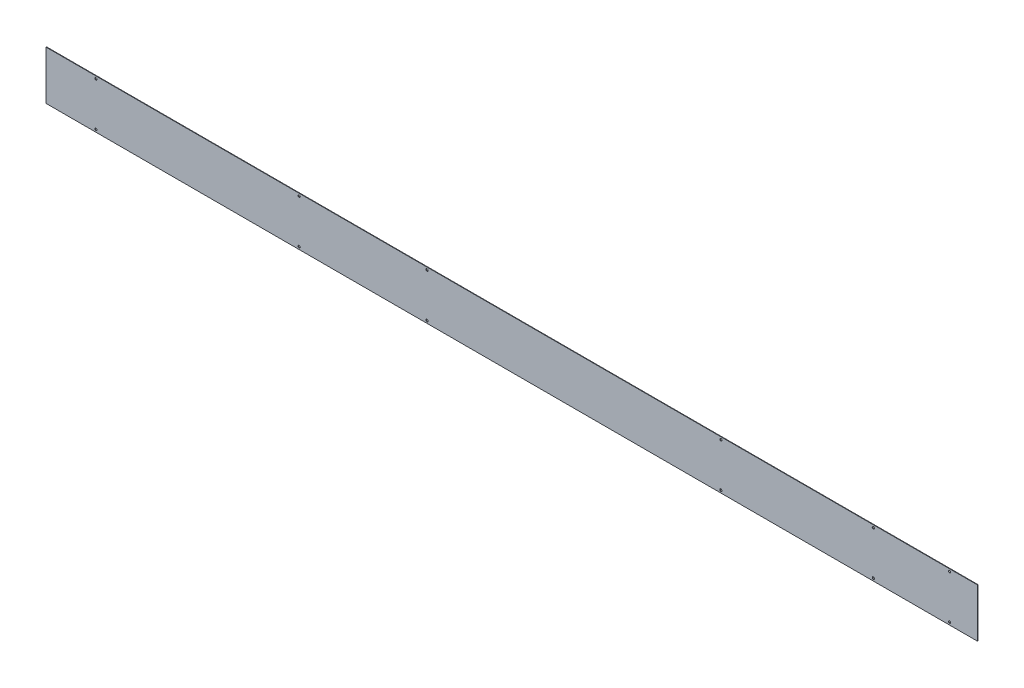
ISO-10303-21;
HEADER;
FILE_DESCRIPTION(('STEP AP214'),'2;1');
FILE_NAME('part.step','',(''),(''),'','','');
FILE_SCHEMA(('AUTOMOTIVE_DESIGN { 1 0 10303 214 1 1 1 1 }'));
ENDSEC;
DATA;
#1=APPLICATION_CONTEXT('core data for automotive mechanical design processes');
#2=APPLICATION_PROTOCOL_DEFINITION('international standard','automotive_design',2000,#1);
#3=PRODUCT_CONTEXT('',#1,'mechanical');
#4=PRODUCT('Part','Part','',(#3));
#5=PRODUCT_RELATED_PRODUCT_CATEGORY('part','',(#4));
#6=PRODUCT_DEFINITION_FORMATION('','',#4);
#7=PRODUCT_DEFINITION_CONTEXT('part definition',#1,'design');
#8=PRODUCT_DEFINITION('design','',#6,#7);
#9=PRODUCT_DEFINITION_SHAPE('','',#8);
#10=(LENGTH_UNIT() NAMED_UNIT(*) SI_UNIT(.MILLI.,.METRE.));
#11=(NAMED_UNIT(*) PLANE_ANGLE_UNIT() SI_UNIT($,.RADIAN.));
#12=(NAMED_UNIT(*) SI_UNIT($,.STERADIAN.) SOLID_ANGLE_UNIT());
#13=UNCERTAINTY_MEASURE_WITH_UNIT(LENGTH_MEASURE(1.E-05),#10,'distance_accuracy_value','');
#14=(GEOMETRIC_REPRESENTATION_CONTEXT(3) GLOBAL_UNCERTAINTY_ASSIGNED_CONTEXT((#13)) GLOBAL_UNIT_ASSIGNED_CONTEXT((#10,
#11,#12)) REPRESENTATION_CONTEXT('',''));
#15=CARTESIAN_POINT('',(0.,0.,0.));
#16=DIRECTION('',(0.,0.,1.));
#17=DIRECTION('',(1.,0.,0.));
#18=AXIS2_PLACEMENT_3D('',#15,#16,#17);
#19=CARTESIAN_POINT('',(698.5,-36.576,-0.75946));
#20=DIRECTION('',(1.,0.,0.));
#21=DIRECTION('',(0.,0.,-1.));
#22=AXIS2_PLACEMENT_3D('',#19,#20,#21);
#23=PLANE('',#22);
#24=DIRECTION('',(0.,1.,0.));
#25=VECTOR('',#24,1.);
#26=CARTESIAN_POINT('',(698.5,-36.576,0.));
#27=LINE('',#26,#25);
#28=CARTESIAN_POINT('',(698.5,-36.576,0.));
#29=VERTEX_POINT('',#28);
#30=CARTESIAN_POINT('',(698.5,36.576,0.));
#31=VERTEX_POINT('',#30);
#32=EDGE_CURVE('E107',#29,#31,#27,.T.);
#33=ORIENTED_EDGE('',*,*,#32,.F.);
#34=DIRECTION('',(0.,0.,1.));
#35=VECTOR('',#34,1.);
#36=CARTESIAN_POINT('',(698.5,-36.576,-0.75946));
#37=LINE('',#36,#35);
#38=CARTESIAN_POINT('',(698.5,-36.576,-0.75946));
#39=VERTEX_POINT('',#38);
#40=EDGE_CURVE('E11',#39,#29,#37,.T.);
#41=ORIENTED_EDGE('',*,*,#40,.F.);
#42=DIRECTION('',(0.,1.,0.));
#43=VECTOR('',#42,1.);
#44=CARTESIAN_POINT('',(698.5,-36.576,-0.75946));
#45=LINE('',#44,#43);
#46=CARTESIAN_POINT('',(698.5,36.576,-0.75946));
#47=VERTEX_POINT('',#46);
#48=EDGE_CURVE('E100',#39,#47,#45,.T.);
#49=ORIENTED_EDGE('',*,*,#48,.T.);
#50=DIRECTION('',(0.,0.,1.));
#51=VECTOR('',#50,1.);
#52=CARTESIAN_POINT('',(698.5,36.576,-0.75946));
#53=LINE('',#52,#51);
#54=EDGE_CURVE('E83',#47,#31,#53,.T.);
#55=ORIENTED_EDGE('',*,*,#54,.T.);
#56=EDGE_LOOP('',(#33,#41,#49,#55));
#57=FACE_BOUND('',#56,.T.);
#58=ADVANCED_FACE('F40',(#57),#23,.T.);
#59=CARTESIAN_POINT('',(-698.5,-36.576,-0.75946));
#60=DIRECTION('',(0.,-1.,0.));
#61=DIRECTION('',(0.,0.,-1.));
#62=AXIS2_PLACEMENT_3D('',#59,#60,#61);
#63=PLANE('',#62);
#64=DIRECTION('',(1.,0.,0.));
#65=VECTOR('',#64,1.);
#66=CARTESIAN_POINT('',(-698.5,-36.576,0.));
#67=LINE('',#66,#65);
#68=CARTESIAN_POINT('',(-698.5,-36.576,0.));
#69=VERTEX_POINT('',#68);
#70=EDGE_CURVE('E102',#69,#29,#67,.T.);
#71=ORIENTED_EDGE('',*,*,#70,.F.);
#72=DIRECTION('',(0.,0.,1.));
#73=VECTOR('',#72,1.);
#74=CARTESIAN_POINT('',(-698.5,-36.576,-0.75946));
#75=LINE('',#74,#73);
#76=CARTESIAN_POINT('',(-698.5,-36.576,-0.75946));
#77=VERTEX_POINT('',#76);
#78=EDGE_CURVE('E49',#77,#69,#75,.T.);
#79=ORIENTED_EDGE('',*,*,#78,.F.);
#80=DIRECTION('',(1.,0.,0.));
#81=VECTOR('',#80,1.);
#82=CARTESIAN_POINT('',(-698.5,-36.576,-0.75946));
#83=LINE('',#82,#81);
#84=EDGE_CURVE('E97',#77,#39,#83,.T.);
#85=ORIENTED_EDGE('',*,*,#84,.T.);
#86=ORIENTED_EDGE('',*,*,#40,.T.);
#87=EDGE_LOOP('',(#71,#79,#85,#86));
#88=FACE_BOUND('',#87,.T.);
#89=ADVANCED_FACE('F170',(#88),#63,.T.);
#90=CARTESIAN_POINT('',(-698.5,-36.576,-0.75946));
#91=DIRECTION('',(-1.,0.,0.));
#92=DIRECTION('',(0.,0.,1.));
#93=AXIS2_PLACEMENT_3D('',#90,#91,#92);
#94=PLANE('',#93);
#95=DIRECTION('',(0.,-1.,0.));
#96=VECTOR('',#95,1.);
#97=CARTESIAN_POINT('',(-698.5,-36.576,0.));
#98=LINE('',#97,#96);
#99=CARTESIAN_POINT('',(-698.5,36.576,0.));
#100=VERTEX_POINT('',#99);
#101=EDGE_CURVE('E91',#100,#69,#98,.T.);
#102=ORIENTED_EDGE('',*,*,#101,.F.);
#103=DIRECTION('',(0.,0.,1.));
#104=VECTOR('',#103,1.);
#105=CARTESIAN_POINT('',(-698.5,36.576,-0.75946));
#106=LINE('',#105,#104);
#107=CARTESIAN_POINT('',(-698.5,36.576,-0.75946));
#108=VERTEX_POINT('',#107);
#109=EDGE_CURVE('E86',#108,#100,#106,.T.);
#110=ORIENTED_EDGE('',*,*,#109,.F.);
#111=DIRECTION('',(0.,-1.,0.));
#112=VECTOR('',#111,1.);
#113=CARTESIAN_POINT('',(-698.5,-36.576,-0.75946));
#114=LINE('',#113,#112);
#115=EDGE_CURVE('E89',#108,#77,#114,.T.);
#116=ORIENTED_EDGE('',*,*,#115,.T.);
#117=ORIENTED_EDGE('',*,*,#78,.T.);
#118=EDGE_LOOP('',(#102,#110,#116,#117));
#119=FACE_BOUND('',#118,.T.);
#120=ADVANCED_FACE('F88',(#119),#94,.T.);
#121=CARTESIAN_POINT('',(-698.5,36.576,-0.75946));
#122=DIRECTION('',(0.,1.,0.));
#123=DIRECTION('',(0.,0.,1.));
#124=AXIS2_PLACEMENT_3D('',#121,#122,#123);
#125=PLANE('',#124);
#126=DIRECTION('',(-1.,0.,0.));
#127=VECTOR('',#126,1.);
#128=CARTESIAN_POINT('',(-698.5,36.576,0.));
#129=LINE('',#128,#127);
#130=EDGE_CURVE('E110',#31,#100,#129,.T.);
#131=ORIENTED_EDGE('',*,*,#130,.F.);
#132=ORIENTED_EDGE('',*,*,#54,.F.);
#133=DIRECTION('',(-1.,0.,0.));
#134=VECTOR('',#133,1.);
#135=CARTESIAN_POINT('',(-698.5,36.576,-0.75946));
#136=LINE('',#135,#134);
#137=EDGE_CURVE('E96',#47,#108,#136,.T.);
#138=ORIENTED_EDGE('',*,*,#137,.T.);
#139=ORIENTED_EDGE('',*,*,#109,.T.);
#140=EDGE_LOOP('',(#131,#132,#138,#139));
#141=FACE_BOUND('',#140,.T.);
#142=ADVANCED_FACE('F99',(#141),#125,.T.);
#143=CARTESIAN_POINT('',(0.,0.,-0.75946));
#144=DIRECTION('',(0.,0.,-1.));
#145=DIRECTION('',(-1.,0.,0.));
#146=AXIS2_PLACEMENT_3D('',#143,#144,#145);
#147=PLANE('',#146);
#148=CARTESIAN_POINT('',(313.69,-32.766,-0.75946));
#149=DIRECTION('',(0.,0.,1.));
#150=DIRECTION('',(1.,0.,0.));
#151=AXIS2_PLACEMENT_3D('',#148,#149,#150);
#152=CIRCLE('',#151,1.6509999999999);
#153=CARTESIAN_POINT('',(315.341,-32.766,-0.75946));
#154=VERTEX_POINT('',#153);
#155=EDGE_CURVE('E400',#154,#154,#152,.T.);
#156=ORIENTED_EDGE('',*,*,#155,.T.);
#157=EDGE_LOOP('',(#156));
#158=FACE_BOUND('',#157,.T.);
#159=CARTESIAN_POINT('',(542.29,32.766,-0.75946));
#160=DIRECTION('',(0.,0.,1.));
#161=DIRECTION('',(1.,0.,0.));
#162=AXIS2_PLACEMENT_3D('',#159,#160,#161);
#163=CIRCLE('',#162,1.65099999999991);
#164=CARTESIAN_POINT('',(543.941,32.766,-0.75946));
#165=VERTEX_POINT('',#164);
#166=EDGE_CURVE('E396',#165,#165,#163,.T.);
#167=ORIENTED_EDGE('',*,*,#166,.T.);
#168=EDGE_LOOP('',(#167));
#169=FACE_BOUND('',#168,.T.);
#170=CARTESIAN_POINT('',(542.29,-32.766,-0.75946));
#171=DIRECTION('',(0.,0.,1.));
#172=DIRECTION('',(1.,0.,0.));
#173=AXIS2_PLACEMENT_3D('',#170,#171,#172);
#174=CIRCLE('',#173,1.65099999999991);
#175=CARTESIAN_POINT('',(543.941,-32.766,-0.75946));
#176=VERTEX_POINT('',#175);
#177=EDGE_CURVE('E365',#176,#176,#174,.T.);
#178=ORIENTED_EDGE('',*,*,#177,.T.);
#179=EDGE_LOOP('',(#178));
#180=FACE_BOUND('',#179,.T.);
#181=CARTESIAN_POINT('',(656.59,32.766,-0.75946));
#182=DIRECTION('',(0.,0.,1.));
#183=DIRECTION('',(1.,0.,0.));
#184=AXIS2_PLACEMENT_3D('',#181,#182,#183);
#185=CIRCLE('',#184,1.65099999999991);
#186=CARTESIAN_POINT('',(658.241,32.766,-0.75946));
#187=VERTEX_POINT('',#186);
#188=EDGE_CURVE('E397',#187,#187,#185,.T.);
#189=ORIENTED_EDGE('',*,*,#188,.T.);
#190=EDGE_LOOP('',(#189));
#191=FACE_BOUND('',#190,.T.);
#192=CARTESIAN_POINT('',(-623.57,-32.766,-0.75946));
#193=DIRECTION('',(0.,0.,1.));
#194=DIRECTION('',(1.,0.,0.));
#195=AXIS2_PLACEMENT_3D('',#192,#193,#194);
#196=CIRCLE('',#195,1.65099999999991);
#197=CARTESIAN_POINT('',(-621.919,-32.766,-0.75946));
#198=VERTEX_POINT('',#197);
#199=EDGE_CURVE('E418',#198,#198,#196,.T.);
#200=ORIENTED_EDGE('',*,*,#199,.T.);
#201=EDGE_LOOP('',(#200));
#202=FACE_BOUND('',#201,.T.);
#203=CARTESIAN_POINT('',(-127.,32.766,-0.75946));
#204=DIRECTION('',(0.,0.,1.));
#205=DIRECTION('',(1.,0.,0.));
#206=AXIS2_PLACEMENT_3D('',#203,#204,#205);
#207=CIRCLE('',#206,1.65099999999999);
#208=CARTESIAN_POINT('',(-125.349,32.766,-0.75946));
#209=VERTEX_POINT('',#208);
#210=EDGE_CURVE('E415',#209,#209,#207,.T.);
#211=ORIENTED_EDGE('',*,*,#210,.T.);
#212=EDGE_LOOP('',(#211));
#213=FACE_BOUND('',#212,.T.);
#214=CARTESIAN_POINT('',(-127.,-32.766,-0.75946));
#215=DIRECTION('',(0.,0.,1.));
#216=DIRECTION('',(1.,0.,0.));
#217=AXIS2_PLACEMENT_3D('',#214,#215,#216);
#218=CIRCLE('',#217,1.65099999999999);
#219=CARTESIAN_POINT('',(-125.349,-32.766,-0.75946));
#220=VERTEX_POINT('',#219);
#221=EDGE_CURVE('E412',#220,#220,#218,.T.);
#222=ORIENTED_EDGE('',*,*,#221,.T.);
#223=EDGE_LOOP('',(#222));
#224=FACE_BOUND('',#223,.T.);
#225=CARTESIAN_POINT('',(313.69,32.766,-0.75946));
#226=DIRECTION('',(0.,0.,1.));
#227=DIRECTION('',(1.,0.,0.));
#228=AXIS2_PLACEMENT_3D('',#225,#226,#227);
#229=CIRCLE('',#228,1.6509999999999);
#230=CARTESIAN_POINT('',(315.341,32.766,-0.75946));
#231=VERTEX_POINT('',#230);
#232=EDGE_CURVE('E410',#231,#231,#229,.T.);
#233=ORIENTED_EDGE('',*,*,#232,.T.);
#234=EDGE_LOOP('',(#233));
#235=FACE_BOUND('',#234,.T.);
#236=CARTESIAN_POINT('',(-318.77,-32.766,-0.75946));
#237=DIRECTION('',(0.,0.,1.));
#238=DIRECTION('',(1.,0.,0.));
#239=AXIS2_PLACEMENT_3D('',#236,#237,#238);
#240=CIRCLE('',#239,1.6509999999999);
#241=CARTESIAN_POINT('',(-317.119,-32.766,-0.75946));
#242=VERTEX_POINT('',#241);
#243=EDGE_CURVE('E435',#242,#242,#240,.T.);
#244=ORIENTED_EDGE('',*,*,#243,.T.);
#245=EDGE_LOOP('',(#244));
#246=FACE_BOUND('',#245,.T.);
#247=CARTESIAN_POINT('',(-318.77,32.766,-0.75946));
#248=DIRECTION('',(0.,0.,1.));
#249=DIRECTION('',(1.,0.,0.));
#250=AXIS2_PLACEMENT_3D('',#247,#248,#249);
#251=CIRCLE('',#250,1.6509999999999);
#252=CARTESIAN_POINT('',(-317.119,32.766,-0.75946));
#253=VERTEX_POINT('',#252);
#254=EDGE_CURVE('E406',#253,#253,#251,.T.);
#255=ORIENTED_EDGE('',*,*,#254,.T.);
#256=EDGE_LOOP('',(#255));
#257=FACE_BOUND('',#256,.T.);
#258=CARTESIAN_POINT('',(656.59,-32.766,-0.75946));
#259=DIRECTION('',(0.,0.,1.));
#260=DIRECTION('',(1.,0.,0.));
#261=AXIS2_PLACEMENT_3D('',#258,#259,#260);
#262=CIRCLE('',#261,1.65099999999991);
#263=CARTESIAN_POINT('',(658.241,-32.766,-0.75946));
#264=VERTEX_POINT('',#263);
#265=EDGE_CURVE('E403',#264,#264,#262,.T.);
#266=ORIENTED_EDGE('',*,*,#265,.T.);
#267=EDGE_LOOP('',(#266));
#268=FACE_BOUND('',#267,.T.);
#269=CARTESIAN_POINT('',(-623.57,32.766,-0.75946));
#270=DIRECTION('',(0.,0.,1.));
#271=DIRECTION('',(1.,0.,0.));
#272=AXIS2_PLACEMENT_3D('',#269,#270,#271);
#273=CIRCLE('',#272,1.65099999999991);
#274=CARTESIAN_POINT('',(-621.919,32.766,-0.75946));
#275=VERTEX_POINT('',#274);
#276=EDGE_CURVE('E121',#275,#275,#273,.T.);
#277=ORIENTED_EDGE('',*,*,#276,.T.);
#278=EDGE_LOOP('',(#277));
#279=FACE_BOUND('',#278,.T.);
#280=ORIENTED_EDGE('',*,*,#48,.F.);
#281=ORIENTED_EDGE('',*,*,#84,.F.);
#282=ORIENTED_EDGE('',*,*,#115,.F.);
#283=ORIENTED_EDGE('',*,*,#137,.F.);
#284=EDGE_LOOP('',(#280,#281,#282,#283));
#285=FACE_BOUND('',#284,.T.);
#286=ADVANCED_FACE('F95',(#158,#169,#180,#191,#202,#213,#224,#235,#246,#257,#268,#279,#285),
#147,.T.);
#287=CARTESIAN_POINT('',(0.,0.,0.));
#288=DIRECTION('',(0.,0.,-1.));
#289=DIRECTION('',(-1.,0.,0.));
#290=AXIS2_PLACEMENT_3D('',#287,#288,#289);
#291=PLANE('',#290);
#292=CARTESIAN_POINT('',(313.69,-32.766,0.));
#293=DIRECTION('',(0.,0.,-1.));
#294=DIRECTION('',(-1.,0.,0.));
#295=AXIS2_PLACEMENT_3D('',#292,#293,#294);
#296=CIRCLE('',#295,1.6509999999999);
#297=CARTESIAN_POINT('',(312.039,-32.766,0.));
#298=VERTEX_POINT('',#297);
#299=EDGE_CURVE('E43',#298,#298,#296,.T.);
#300=ORIENTED_EDGE('',*,*,#299,.T.);
#301=EDGE_LOOP('',(#300));
#302=FACE_BOUND('',#301,.T.);
#303=CARTESIAN_POINT('',(542.29,32.766,0.));
#304=DIRECTION('',(0.,0.,-1.));
#305=DIRECTION('',(-1.,0.,0.));
#306=AXIS2_PLACEMENT_3D('',#303,#304,#305);
#307=CIRCLE('',#306,1.65099999999991);
#308=CARTESIAN_POINT('',(540.639,32.766,0.));
#309=VERTEX_POINT('',#308);
#310=EDGE_CURVE('E147',#309,#309,#307,.T.);
#311=ORIENTED_EDGE('',*,*,#310,.T.);
#312=EDGE_LOOP('',(#311));
#313=FACE_BOUND('',#312,.T.);
#314=CARTESIAN_POINT('',(542.29,-32.766,0.));
#315=DIRECTION('',(0.,0.,-1.));
#316=DIRECTION('',(-1.,0.,0.));
#317=AXIS2_PLACEMENT_3D('',#314,#315,#316);
#318=CIRCLE('',#317,1.65099999999991);
#319=CARTESIAN_POINT('',(540.639,-32.766,0.));
#320=VERTEX_POINT('',#319);
#321=EDGE_CURVE('E145',#320,#320,#318,.T.);
#322=ORIENTED_EDGE('',*,*,#321,.T.);
#323=EDGE_LOOP('',(#322));
#324=FACE_BOUND('',#323,.T.);
#325=CARTESIAN_POINT('',(656.59,32.766,0.));
#326=DIRECTION('',(0.,0.,-1.));
#327=DIRECTION('',(-1.,0.,0.));
#328=AXIS2_PLACEMENT_3D('',#325,#326,#327);
#329=CIRCLE('',#328,1.65099999999991);
#330=CARTESIAN_POINT('',(654.939,32.766,0.));
#331=VERTEX_POINT('',#330);
#332=EDGE_CURVE('E142',#331,#331,#329,.T.);
#333=ORIENTED_EDGE('',*,*,#332,.T.);
#334=EDGE_LOOP('',(#333));
#335=FACE_BOUND('',#334,.T.);
#336=CARTESIAN_POINT('',(-623.57,-32.766,0.));
#337=DIRECTION('',(0.,0.,-1.));
#338=DIRECTION('',(-1.,0.,0.));
#339=AXIS2_PLACEMENT_3D('',#336,#337,#338);
#340=CIRCLE('',#339,1.65099999999991);
#341=CARTESIAN_POINT('',(-625.221,-32.766,0.));
#342=VERTEX_POINT('',#341);
#343=EDGE_CURVE('E139',#342,#342,#340,.T.);
#344=ORIENTED_EDGE('',*,*,#343,.T.);
#345=EDGE_LOOP('',(#344));
#346=FACE_BOUND('',#345,.T.);
#347=CARTESIAN_POINT('',(-127.,32.766,0.));
#348=DIRECTION('',(0.,0.,-1.));
#349=DIRECTION('',(-1.,0.,0.));
#350=AXIS2_PLACEMENT_3D('',#347,#348,#349);
#351=CIRCLE('',#350,1.65099999999999);
#352=CARTESIAN_POINT('',(-128.651,32.766,0.));
#353=VERTEX_POINT('',#352);
#354=EDGE_CURVE('E136',#353,#353,#351,.T.);
#355=ORIENTED_EDGE('',*,*,#354,.T.);
#356=EDGE_LOOP('',(#355));
#357=FACE_BOUND('',#356,.T.);
#358=CARTESIAN_POINT('',(-127.,-32.766,0.));
#359=DIRECTION('',(0.,0.,-1.));
#360=DIRECTION('',(-1.,0.,0.));
#361=AXIS2_PLACEMENT_3D('',#358,#359,#360);
#362=CIRCLE('',#361,1.65099999999999);
#363=CARTESIAN_POINT('',(-128.651,-32.766,0.));
#364=VERTEX_POINT('',#363);
#365=EDGE_CURVE('E133',#364,#364,#362,.T.);
#366=ORIENTED_EDGE('',*,*,#365,.T.);
#367=EDGE_LOOP('',(#366));
#368=FACE_BOUND('',#367,.T.);
#369=CARTESIAN_POINT('',(313.69,32.766,0.));
#370=DIRECTION('',(0.,0.,-1.));
#371=DIRECTION('',(-1.,0.,0.));
#372=AXIS2_PLACEMENT_3D('',#369,#370,#371);
#373=CIRCLE('',#372,1.6509999999999);
#374=CARTESIAN_POINT('',(312.039,32.766,0.));
#375=VERTEX_POINT('',#374);
#376=EDGE_CURVE('E130',#375,#375,#373,.T.);
#377=ORIENTED_EDGE('',*,*,#376,.T.);
#378=EDGE_LOOP('',(#377));
#379=FACE_BOUND('',#378,.T.);
#380=CARTESIAN_POINT('',(-318.77,-32.766,0.));
#381=DIRECTION('',(0.,0.,-1.));
#382=DIRECTION('',(-1.,0.,0.));
#383=AXIS2_PLACEMENT_3D('',#380,#381,#382);
#384=CIRCLE('',#383,1.6509999999999);
#385=CARTESIAN_POINT('',(-320.421,-32.766,0.));
#386=VERTEX_POINT('',#385);
#387=EDGE_CURVE('E127',#386,#386,#384,.T.);
#388=ORIENTED_EDGE('',*,*,#387,.T.);
#389=EDGE_LOOP('',(#388));
#390=FACE_BOUND('',#389,.T.);
#391=CARTESIAN_POINT('',(-318.77,32.766,0.));
#392=DIRECTION('',(0.,0.,-1.));
#393=DIRECTION('',(-1.,0.,0.));
#394=AXIS2_PLACEMENT_3D('',#391,#392,#393);
#395=CIRCLE('',#394,1.6509999999999);
#396=CARTESIAN_POINT('',(-320.421,32.766,0.));
#397=VERTEX_POINT('',#396);
#398=EDGE_CURVE('E124',#397,#397,#395,.T.);
#399=ORIENTED_EDGE('',*,*,#398,.T.);
#400=EDGE_LOOP('',(#399));
#401=FACE_BOUND('',#400,.T.);
#402=CARTESIAN_POINT('',(656.59,-32.766,0.));
#403=DIRECTION('',(0.,0.,-1.));
#404=DIRECTION('',(-1.,0.,0.));
#405=AXIS2_PLACEMENT_3D('',#402,#403,#404);
#406=CIRCLE('',#405,1.65099999999991);
#407=CARTESIAN_POINT('',(654.939,-32.766,0.));
#408=VERTEX_POINT('',#407);
#409=EDGE_CURVE('E120',#408,#408,#406,.T.);
#410=ORIENTED_EDGE('',*,*,#409,.T.);
#411=EDGE_LOOP('',(#410));
#412=FACE_BOUND('',#411,.T.);
#413=CARTESIAN_POINT('',(-623.57,32.766,0.));
#414=DIRECTION('',(0.,0.,-1.));
#415=DIRECTION('',(-1.,0.,0.));
#416=AXIS2_PLACEMENT_3D('',#413,#414,#415);
#417=CIRCLE('',#416,1.65099999999991);
#418=CARTESIAN_POINT('',(-625.221,32.766,0.));
#419=VERTEX_POINT('',#418);
#420=EDGE_CURVE('E117',#419,#419,#417,.T.);
#421=ORIENTED_EDGE('',*,*,#420,.T.);
#422=EDGE_LOOP('',(#421));
#423=FACE_BOUND('',#422,.T.);
#424=ORIENTED_EDGE('',*,*,#32,.T.);
#425=ORIENTED_EDGE('',*,*,#130,.T.);
#426=ORIENTED_EDGE('',*,*,#101,.T.);
#427=ORIENTED_EDGE('',*,*,#70,.T.);
#428=EDGE_LOOP('',(#424,#425,#426,#427));
#429=FACE_BOUND('',#428,.T.);
#430=ADVANCED_FACE('F154',(#302,#313,#324,#335,#346,#357,#368,#379,#390,#401,#412,#423,#429),
#291,.F.);
#431=CARTESIAN_POINT('',(-623.57,32.766,-0.75946));
#432=DIRECTION('',(0.,0.,1.));
#433=DIRECTION('',(1.,0.,0.));
#434=AXIS2_PLACEMENT_3D('',#431,#432,#433);
#435=CYLINDRICAL_SURFACE('',#434,1.65099999999991);
#436=ORIENTED_EDGE('',*,*,#276,.F.);
#437=EDGE_LOOP('',(#436));
#438=FACE_BOUND('',#437,.T.);
#439=ORIENTED_EDGE('',*,*,#420,.F.);
#440=EDGE_LOOP('',(#439));
#441=FACE_BOUND('',#440,.T.);
#442=ADVANCED_FACE('F177',(#438,#441),#435,.F.);
#443=CARTESIAN_POINT('',(656.59,-32.766,-0.75946));
#444=DIRECTION('',(0.,0.,1.));
#445=DIRECTION('',(1.,0.,0.));
#446=AXIS2_PLACEMENT_3D('',#443,#444,#445);
#447=CYLINDRICAL_SURFACE('',#446,1.65099999999991);
#448=ORIENTED_EDGE('',*,*,#265,.F.);
#449=EDGE_LOOP('',(#448));
#450=FACE_BOUND('',#449,.T.);
#451=ORIENTED_EDGE('',*,*,#409,.F.);
#452=EDGE_LOOP('',(#451));
#453=FACE_BOUND('',#452,.T.);
#454=ADVANCED_FACE('F184',(#450,#453),#447,.F.);
#455=CARTESIAN_POINT('',(-318.77,32.766,-0.75946));
#456=DIRECTION('',(0.,0.,1.));
#457=DIRECTION('',(1.,0.,0.));
#458=AXIS2_PLACEMENT_3D('',#455,#456,#457);
#459=CYLINDRICAL_SURFACE('',#458,1.6509999999999);
#460=ORIENTED_EDGE('',*,*,#254,.F.);
#461=EDGE_LOOP('',(#460));
#462=FACE_BOUND('',#461,.T.);
#463=ORIENTED_EDGE('',*,*,#398,.F.);
#464=EDGE_LOOP('',(#463));
#465=FACE_BOUND('',#464,.T.);
#466=ADVANCED_FACE('F217',(#462,#465),#459,.F.);
#467=CARTESIAN_POINT('',(-318.77,-32.766,-0.75946));
#468=DIRECTION('',(0.,0.,1.));
#469=DIRECTION('',(1.,0.,0.));
#470=AXIS2_PLACEMENT_3D('',#467,#468,#469);
#471=CYLINDRICAL_SURFACE('',#470,1.6509999999999);
#472=ORIENTED_EDGE('',*,*,#243,.F.);
#473=EDGE_LOOP('',(#472));
#474=FACE_BOUND('',#473,.T.);
#475=ORIENTED_EDGE('',*,*,#387,.F.);
#476=EDGE_LOOP('',(#475));
#477=FACE_BOUND('',#476,.T.);
#478=ADVANCED_FACE('F225',(#474,#477),#471,.F.);
#479=CARTESIAN_POINT('',(313.69,32.766,-0.75946));
#480=DIRECTION('',(0.,0.,1.));
#481=DIRECTION('',(1.,0.,0.));
#482=AXIS2_PLACEMENT_3D('',#479,#480,#481);
#483=CYLINDRICAL_SURFACE('',#482,1.6509999999999);
#484=ORIENTED_EDGE('',*,*,#232,.F.);
#485=EDGE_LOOP('',(#484));
#486=FACE_BOUND('',#485,.T.);
#487=ORIENTED_EDGE('',*,*,#376,.F.);
#488=EDGE_LOOP('',(#487));
#489=FACE_BOUND('',#488,.T.);
#490=ADVANCED_FACE('F233',(#486,#489),#483,.F.);
#491=CARTESIAN_POINT('',(-127.,-32.766,-0.75946));
#492=DIRECTION('',(0.,0.,1.));
#493=DIRECTION('',(1.,0.,0.));
#494=AXIS2_PLACEMENT_3D('',#491,#492,#493);
#495=CYLINDRICAL_SURFACE('',#494,1.65099999999999);
#496=ORIENTED_EDGE('',*,*,#221,.F.);
#497=EDGE_LOOP('',(#496));
#498=FACE_BOUND('',#497,.T.);
#499=ORIENTED_EDGE('',*,*,#365,.F.);
#500=EDGE_LOOP('',(#499));
#501=FACE_BOUND('',#500,.T.);
#502=ADVANCED_FACE('F241',(#498,#501),#495,.F.);
#503=CARTESIAN_POINT('',(-127.,32.766,-0.75946));
#504=DIRECTION('',(0.,0.,1.));
#505=DIRECTION('',(1.,0.,0.));
#506=AXIS2_PLACEMENT_3D('',#503,#504,#505);
#507=CYLINDRICAL_SURFACE('',#506,1.65099999999999);
#508=ORIENTED_EDGE('',*,*,#210,.F.);
#509=EDGE_LOOP('',(#508));
#510=FACE_BOUND('',#509,.T.);
#511=ORIENTED_EDGE('',*,*,#354,.F.);
#512=EDGE_LOOP('',(#511));
#513=FACE_BOUND('',#512,.T.);
#514=ADVANCED_FACE('F249',(#510,#513),#507,.F.);
#515=CARTESIAN_POINT('',(-623.57,-32.766,-0.75946));
#516=DIRECTION('',(0.,0.,1.));
#517=DIRECTION('',(1.,0.,0.));
#518=AXIS2_PLACEMENT_3D('',#515,#516,#517);
#519=CYLINDRICAL_SURFACE('',#518,1.65099999999991);
#520=ORIENTED_EDGE('',*,*,#199,.F.);
#521=EDGE_LOOP('',(#520));
#522=FACE_BOUND('',#521,.T.);
#523=ORIENTED_EDGE('',*,*,#343,.F.);
#524=EDGE_LOOP('',(#523));
#525=FACE_BOUND('',#524,.T.);
#526=ADVANCED_FACE('F257',(#522,#525),#519,.F.);
#527=CARTESIAN_POINT('',(656.59,32.766,-0.75946));
#528=DIRECTION('',(0.,0.,1.));
#529=DIRECTION('',(1.,0.,0.));
#530=AXIS2_PLACEMENT_3D('',#527,#528,#529);
#531=CYLINDRICAL_SURFACE('',#530,1.65099999999991);
#532=ORIENTED_EDGE('',*,*,#188,.F.);
#533=EDGE_LOOP('',(#532));
#534=FACE_BOUND('',#533,.T.);
#535=ORIENTED_EDGE('',*,*,#332,.F.);
#536=EDGE_LOOP('',(#535));
#537=FACE_BOUND('',#536,.T.);
#538=ADVANCED_FACE('F265',(#534,#537),#531,.F.);
#539=CARTESIAN_POINT('',(542.29,-32.766,-0.75946));
#540=DIRECTION('',(0.,0.,1.));
#541=DIRECTION('',(1.,0.,0.));
#542=AXIS2_PLACEMENT_3D('',#539,#540,#541);
#543=CYLINDRICAL_SURFACE('',#542,1.65099999999991);
#544=ORIENTED_EDGE('',*,*,#177,.F.);
#545=EDGE_LOOP('',(#544));
#546=FACE_BOUND('',#545,.T.);
#547=ORIENTED_EDGE('',*,*,#321,.F.);
#548=EDGE_LOOP('',(#547));
#549=FACE_BOUND('',#548,.T.);
#550=ADVANCED_FACE('F164',(#546,#549),#543,.F.);
#551=CARTESIAN_POINT('',(542.29,32.766,-0.75946));
#552=DIRECTION('',(0.,0.,1.));
#553=DIRECTION('',(1.,0.,0.));
#554=AXIS2_PLACEMENT_3D('',#551,#552,#553);
#555=CYLINDRICAL_SURFACE('',#554,1.65099999999991);
#556=ORIENTED_EDGE('',*,*,#166,.F.);
#557=EDGE_LOOP('',(#556));
#558=FACE_BOUND('',#557,.T.);
#559=ORIENTED_EDGE('',*,*,#310,.F.);
#560=EDGE_LOOP('',(#559));
#561=FACE_BOUND('',#560,.T.);
#562=ADVANCED_FACE('F158',(#558,#561),#555,.F.);
#563=CARTESIAN_POINT('',(313.69,-32.766,-0.75946));
#564=DIRECTION('',(0.,0.,1.));
#565=DIRECTION('',(1.,0.,0.));
#566=AXIS2_PLACEMENT_3D('',#563,#564,#565);
#567=CYLINDRICAL_SURFACE('',#566,1.6509999999999);
#568=ORIENTED_EDGE('',*,*,#155,.F.);
#569=EDGE_LOOP('',(#568));
#570=FACE_BOUND('',#569,.T.);
#571=ORIENTED_EDGE('',*,*,#299,.F.);
#572=EDGE_LOOP('',(#571));
#573=FACE_BOUND('',#572,.T.);
#574=ADVANCED_FACE('F156',(#570,#573),#567,.F.);
#575=CLOSED_SHELL('',(#58,#89,#120,#142,#286,#430,#442,#454,#466,#478,#490,#502,#514,#526,#538,
#550,#562,#574));
#576=MANIFOLD_SOLID_BREP('B2',#575);
#577=ADVANCED_BREP_SHAPE_REPRESENTATION('',(#18,#576),#14);
#578=SHAPE_DEFINITION_REPRESENTATION(#9,#577);
ENDSEC;
END-ISO-10303-21;
